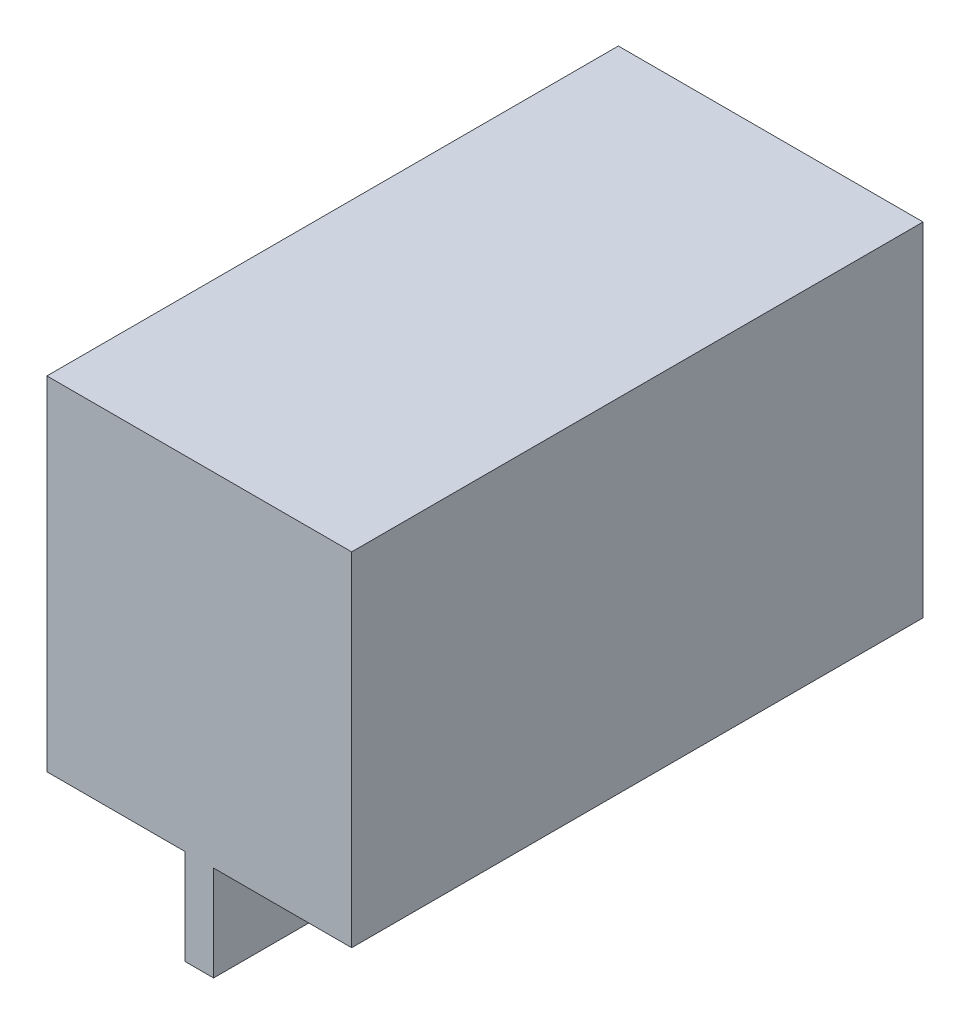
ISO-10303-21;
HEADER;
FILE_DESCRIPTION(('STEP AP214'),'2;1');
FILE_NAME('part.step','',(''),(''),'','','');
FILE_SCHEMA(('AUTOMOTIVE_DESIGN { 1 0 10303 214 1 1 1 1 }'));
ENDSEC;
DATA;
#1=APPLICATION_CONTEXT('core data for automotive mechanical design processes');
#2=APPLICATION_PROTOCOL_DEFINITION('international standard','automotive_design',2000,#1);
#3=PRODUCT_CONTEXT('',#1,'mechanical');
#4=PRODUCT('Part','Part','',(#3));
#5=PRODUCT_RELATED_PRODUCT_CATEGORY('part','',(#4));
#6=PRODUCT_DEFINITION_FORMATION('','',#4);
#7=PRODUCT_DEFINITION_CONTEXT('part definition',#1,'design');
#8=PRODUCT_DEFINITION('design','',#6,#7);
#9=PRODUCT_DEFINITION_SHAPE('','',#8);
#10=(LENGTH_UNIT() NAMED_UNIT(*) SI_UNIT(.MILLI.,.METRE.));
#11=(NAMED_UNIT(*) PLANE_ANGLE_UNIT() SI_UNIT($,.RADIAN.));
#12=(NAMED_UNIT(*) SI_UNIT($,.STERADIAN.) SOLID_ANGLE_UNIT());
#13=UNCERTAINTY_MEASURE_WITH_UNIT(LENGTH_MEASURE(1.E-05),#10,'distance_accuracy_value','');
#14=(GEOMETRIC_REPRESENTATION_CONTEXT(3) GLOBAL_UNCERTAINTY_ASSIGNED_CONTEXT((#13)) GLOBAL_UNIT_ASSIGNED_CONTEXT((#10,
#11,#12)) REPRESENTATION_CONTEXT('',''));
#15=CARTESIAN_POINT('',(0.,0.,0.));
#16=DIRECTION('',(0.,0.,1.));
#17=DIRECTION('',(1.,0.,0.));
#18=AXIS2_PLACEMENT_3D('',#15,#16,#17);
#19=CARTESIAN_POINT('',(0.,0.,0.));
#20=DIRECTION('',(0.,-1.,0.));
#21=DIRECTION('',(0.,0.,-1.));
#22=AXIS2_PLACEMENT_3D('',#19,#20,#21);
#23=PLANE('',#22);
#24=DIRECTION('',(0.,0.,-1.));
#25=VECTOR('',#24,1.);
#26=CARTESIAN_POINT('',(7.25,0.,-15.));
#27=LINE('',#26,#25);
#28=CARTESIAN_POINT('',(7.25,0.,0.));
#29=VERTEX_POINT('',#28);
#30=CARTESIAN_POINT('',(7.25,0.,-30.));
#31=VERTEX_POINT('',#30);
#32=EDGE_CURVE('E48',#29,#31,#27,.T.);
#33=ORIENTED_EDGE('',*,*,#32,.F.);
#34=DIRECTION('',(1.,0.,0.));
#35=VECTOR('',#34,1.);
#36=CARTESIAN_POINT('',(0.,0.,0.));
#37=LINE('',#36,#35);
#38=CARTESIAN_POINT('',(0.,0.,0.));
#39=VERTEX_POINT('',#38);
#40=EDGE_CURVE('E138',#39,#29,#37,.T.);
#41=ORIENTED_EDGE('',*,*,#40,.F.);
#42=DIRECTION('',(0.,0.,1.));
#43=VECTOR('',#42,1.);
#44=CARTESIAN_POINT('',(0.,0.,0.));
#45=LINE('',#44,#43);
#46=CARTESIAN_POINT('',(0.,0.,-30.));
#47=VERTEX_POINT('',#46);
#48=EDGE_CURVE('E118',#47,#39,#45,.T.);
#49=ORIENTED_EDGE('',*,*,#48,.F.);
#50=DIRECTION('',(-1.,0.,0.));
#51=VECTOR('',#50,1.);
#52=CARTESIAN_POINT('',(0.,0.,-30.));
#53=LINE('',#52,#51);
#54=EDGE_CURVE('E53',#31,#47,#53,.T.);
#55=ORIENTED_EDGE('',*,*,#54,.F.);
#56=EDGE_LOOP('',(#33,#41,#49,#55));
#57=FACE_BOUND('',#56,.T.);
#58=ADVANCED_FACE('F33',(#57),#23,.T.);
#59=CARTESIAN_POINT('',(0.,18.,0.));
#60=DIRECTION('',(1.,0.,0.));
#61=DIRECTION('',(0.,0.,-1.));
#62=AXIS2_PLACEMENT_3D('',#59,#60,#61);
#63=PLANE('',#62);
#64=ORIENTED_EDGE('',*,*,#48,.T.);
#65=DIRECTION('',(0.,-1.,0.));
#66=VECTOR('',#65,1.);
#67=CARTESIAN_POINT('',(0.,18.,0.));
#68=LINE('',#67,#66);
#69=CARTESIAN_POINT('',(0.,18.,0.));
#70=VERTEX_POINT('',#69);
#71=EDGE_CURVE('E11',#70,#39,#68,.T.);
#72=ORIENTED_EDGE('',*,*,#71,.F.);
#73=DIRECTION('',(0.,0.,1.));
#74=VECTOR('',#73,1.);
#75=CARTESIAN_POINT('',(0.,18.,0.));
#76=LINE('',#75,#74);
#77=CARTESIAN_POINT('',(0.,18.,-30.));
#78=VERTEX_POINT('',#77);
#79=EDGE_CURVE('E127',#78,#70,#76,.T.);
#80=ORIENTED_EDGE('',*,*,#79,.F.);
#81=DIRECTION('',(0.,-1.,0.));
#82=VECTOR('',#81,1.);
#83=CARTESIAN_POINT('',(0.,18.,-30.));
#84=LINE('',#83,#82);
#85=EDGE_CURVE('E136',#78,#47,#84,.T.);
#86=ORIENTED_EDGE('',*,*,#85,.T.);
#87=EDGE_LOOP('',(#64,#72,#80,#86));
#88=FACE_BOUND('',#87,.T.);
#89=ADVANCED_FACE('F35',(#88),#63,.F.);
#90=CARTESIAN_POINT('',(0.,18.,0.));
#91=DIRECTION('',(0.,0.,-1.));
#92=DIRECTION('',(-1.,0.,0.));
#93=AXIS2_PLACEMENT_3D('',#90,#91,#92);
#94=PLANE('',#93);
#95=ORIENTED_EDGE('',*,*,#40,.T.);
#96=DIRECTION('',(0.,1.,0.));
#97=VECTOR('',#96,1.);
#98=CARTESIAN_POINT('',(7.25,-5.,0.));
#99=LINE('',#98,#97);
#100=CARTESIAN_POINT('',(7.25,-5.,0.));
#101=VERTEX_POINT('',#100);
#102=EDGE_CURVE('E166',#101,#29,#99,.T.);
#103=ORIENTED_EDGE('',*,*,#102,.F.);
#104=DIRECTION('',(-1.,0.,0.));
#105=VECTOR('',#104,1.);
#106=CARTESIAN_POINT('',(7.25,-5.,0.));
#107=LINE('',#106,#105);
#108=CARTESIAN_POINT('',(8.75,-5.,0.));
#109=VERTEX_POINT('',#108);
#110=EDGE_CURVE('E112',#109,#101,#107,.T.);
#111=ORIENTED_EDGE('',*,*,#110,.F.);
#112=DIRECTION('',(0.,1.,0.));
#113=VECTOR('',#112,1.);
#114=CARTESIAN_POINT('',(8.75,-5.,0.));
#115=LINE('',#114,#113);
#116=CARTESIAN_POINT('',(8.75,0.,0.));
#117=VERTEX_POINT('',#116);
#118=EDGE_CURVE('E123',#109,#117,#115,.T.);
#119=ORIENTED_EDGE('',*,*,#118,.T.);
#120=CARTESIAN_POINT('',(16.,0.,0.));
#121=VERTEX_POINT('',#120);
#122=EDGE_CURVE('E121',#117,#121,#37,.T.);
#123=ORIENTED_EDGE('',*,*,#122,.T.);
#124=DIRECTION('',(0.,-1.,0.));
#125=VECTOR('',#124,1.);
#126=CARTESIAN_POINT('',(16.,18.,0.));
#127=LINE('',#126,#125);
#128=CARTESIAN_POINT('',(16.,18.,0.));
#129=VERTEX_POINT('',#128);
#130=EDGE_CURVE('E41',#129,#121,#127,.T.);
#131=ORIENTED_EDGE('',*,*,#130,.F.);
#132=DIRECTION('',(1.,0.,0.));
#133=VECTOR('',#132,1.);
#134=CARTESIAN_POINT('',(0.,18.,0.));
#135=LINE('',#134,#133);
#136=EDGE_CURVE('E130',#70,#129,#135,.T.);
#137=ORIENTED_EDGE('',*,*,#136,.F.);
#138=ORIENTED_EDGE('',*,*,#71,.T.);
#139=EDGE_LOOP('',(#95,#103,#111,#119,#123,#131,#137,#138));
#140=FACE_BOUND('',#139,.T.);
#141=ADVANCED_FACE('F171',(#140),#94,.F.);
#142=CARTESIAN_POINT('',(16.,18.,0.));
#143=DIRECTION('',(-1.,0.,0.));
#144=DIRECTION('',(0.,0.,1.));
#145=AXIS2_PLACEMENT_3D('',#142,#143,#144);
#146=PLANE('',#145);
#147=DIRECTION('',(0.,0.,-1.));
#148=VECTOR('',#147,1.);
#149=CARTESIAN_POINT('',(16.,0.,0.));
#150=LINE('',#149,#148);
#151=CARTESIAN_POINT('',(16.,0.,-30.));
#152=VERTEX_POINT('',#151);
#153=EDGE_CURVE('E140',#121,#152,#150,.T.);
#154=ORIENTED_EDGE('',*,*,#153,.T.);
#155=DIRECTION('',(0.,-1.,0.));
#156=VECTOR('',#155,1.);
#157=CARTESIAN_POINT('',(16.,18.,-30.));
#158=LINE('',#157,#156);
#159=CARTESIAN_POINT('',(16.,18.,-30.));
#160=VERTEX_POINT('',#159);
#161=EDGE_CURVE('E145',#160,#152,#158,.T.);
#162=ORIENTED_EDGE('',*,*,#161,.F.);
#163=DIRECTION('',(0.,0.,-1.));
#164=VECTOR('',#163,1.);
#165=CARTESIAN_POINT('',(16.,18.,0.));
#166=LINE('',#165,#164);
#167=EDGE_CURVE('E133',#129,#160,#166,.T.);
#168=ORIENTED_EDGE('',*,*,#167,.F.);
#169=ORIENTED_EDGE('',*,*,#130,.T.);
#170=EDGE_LOOP('',(#154,#162,#168,#169));
#171=FACE_BOUND('',#170,.T.);
#172=ADVANCED_FACE('F152',(#171),#146,.F.);
#173=CARTESIAN_POINT('',(0.,18.,-30.));
#174=DIRECTION('',(0.,0.,1.));
#175=DIRECTION('',(1.,0.,0.));
#176=AXIS2_PLACEMENT_3D('',#173,#174,#175);
#177=PLANE('',#176);
#178=CARTESIAN_POINT('',(8.75,0.,-30.));
#179=VERTEX_POINT('',#178);
#180=EDGE_CURVE('E131',#152,#179,#53,.T.);
#181=ORIENTED_EDGE('',*,*,#180,.T.);
#182=DIRECTION('',(0.,1.,0.));
#183=VECTOR('',#182,1.);
#184=CARTESIAN_POINT('',(8.75,-5.,-30.));
#185=LINE('',#184,#183);
#186=CARTESIAN_POINT('',(8.75,-5.,-30.));
#187=VERTEX_POINT('',#186);
#188=EDGE_CURVE('E103',#187,#179,#185,.T.);
#189=ORIENTED_EDGE('',*,*,#188,.F.);
#190=DIRECTION('',(1.,0.,0.));
#191=VECTOR('',#190,1.);
#192=CARTESIAN_POINT('',(7.25,-5.,-30.));
#193=LINE('',#192,#191);
#194=CARTESIAN_POINT('',(7.25,-5.,-30.));
#195=VERTEX_POINT('',#194);
#196=EDGE_CURVE('E96',#195,#187,#193,.T.);
#197=ORIENTED_EDGE('',*,*,#196,.F.);
#198=DIRECTION('',(0.,1.,0.));
#199=VECTOR('',#198,1.);
#200=CARTESIAN_POINT('',(7.25,-5.,-30.));
#201=LINE('',#200,#199);
#202=EDGE_CURVE('E101',#195,#31,#201,.T.);
#203=ORIENTED_EDGE('',*,*,#202,.T.);
#204=ORIENTED_EDGE('',*,*,#54,.T.);
#205=ORIENTED_EDGE('',*,*,#85,.F.);
#206=DIRECTION('',(-1.,0.,0.));
#207=VECTOR('',#206,1.);
#208=CARTESIAN_POINT('',(0.,18.,-30.));
#209=LINE('',#208,#207);
#210=EDGE_CURVE('E135',#160,#78,#209,.T.);
#211=ORIENTED_EDGE('',*,*,#210,.F.);
#212=ORIENTED_EDGE('',*,*,#161,.T.);
#213=EDGE_LOOP('',(#181,#189,#197,#203,#204,#205,#211,#212));
#214=FACE_BOUND('',#213,.T.);
#215=ADVANCED_FACE('F99',(#214),#177,.F.);
#216=CARTESIAN_POINT('',(0.,18.,0.));
#217=DIRECTION('',(0.,-1.,0.));
#218=DIRECTION('',(0.,0.,-1.));
#219=AXIS2_PLACEMENT_3D('',#216,#217,#218);
#220=PLANE('',#219);
#221=ORIENTED_EDGE('',*,*,#79,.T.);
#222=ORIENTED_EDGE('',*,*,#136,.T.);
#223=ORIENTED_EDGE('',*,*,#167,.T.);
#224=ORIENTED_EDGE('',*,*,#210,.T.);
#225=EDGE_LOOP('',(#221,#222,#223,#224));
#226=FACE_BOUND('',#225,.T.);
#227=ADVANCED_FACE('F177',(#226),#220,.F.);
#228=DIRECTION('',(0.,0.,1.));
#229=VECTOR('',#228,1.);
#230=CARTESIAN_POINT('',(8.75,0.,-15.));
#231=LINE('',#230,#229);
#232=EDGE_CURVE('E159',#179,#117,#231,.T.);
#233=ORIENTED_EDGE('',*,*,#232,.F.);
#234=ORIENTED_EDGE('',*,*,#180,.F.);
#235=ORIENTED_EDGE('',*,*,#153,.F.);
#236=ORIENTED_EDGE('',*,*,#122,.F.);
#237=EDGE_LOOP('',(#233,#234,#235,#236));
#238=FACE_BOUND('',#237,.T.);
#239=ADVANCED_FACE('F157',(#238),#23,.T.);
#240=CARTESIAN_POINT('',(8.75,-5.,-15.));
#241=DIRECTION('',(-1.,0.,0.));
#242=DIRECTION('',(0.,0.,1.));
#243=AXIS2_PLACEMENT_3D('',#240,#241,#242);
#244=PLANE('',#243);
#245=ORIENTED_EDGE('',*,*,#232,.T.);
#246=ORIENTED_EDGE('',*,*,#118,.F.);
#247=DIRECTION('',(0.,0.,1.));
#248=VECTOR('',#247,1.);
#249=CARTESIAN_POINT('',(8.75,-5.,-15.));
#250=LINE('',#249,#248);
#251=EDGE_CURVE('E106',#187,#109,#250,.T.);
#252=ORIENTED_EDGE('',*,*,#251,.F.);
#253=ORIENTED_EDGE('',*,*,#188,.T.);
#254=EDGE_LOOP('',(#245,#246,#252,#253));
#255=FACE_BOUND('',#254,.T.);
#256=ADVANCED_FACE('F162',(#255),#244,.F.);
#257=CARTESIAN_POINT('',(7.25,-5.,-15.));
#258=DIRECTION('',(1.,0.,0.));
#259=DIRECTION('',(0.,0.,-1.));
#260=AXIS2_PLACEMENT_3D('',#257,#258,#259);
#261=PLANE('',#260);
#262=ORIENTED_EDGE('',*,*,#32,.T.);
#263=ORIENTED_EDGE('',*,*,#202,.F.);
#264=DIRECTION('',(0.,0.,-1.));
#265=VECTOR('',#264,1.);
#266=CARTESIAN_POINT('',(7.25,-5.,-15.));
#267=LINE('',#266,#265);
#268=EDGE_CURVE('E107',#101,#195,#267,.T.);
#269=ORIENTED_EDGE('',*,*,#268,.F.);
#270=ORIENTED_EDGE('',*,*,#102,.T.);
#271=EDGE_LOOP('',(#262,#263,#269,#270));
#272=FACE_BOUND('',#271,.T.);
#273=ADVANCED_FACE('F117',(#272),#261,.F.);
#274=CARTESIAN_POINT('',(0.,-5.,0.));
#275=DIRECTION('',(0.,-1.,0.));
#276=DIRECTION('',(0.,0.,-1.));
#277=AXIS2_PLACEMENT_3D('',#274,#275,#276);
#278=PLANE('',#277);
#279=ORIENTED_EDGE('',*,*,#268,.T.);
#280=ORIENTED_EDGE('',*,*,#196,.T.);
#281=ORIENTED_EDGE('',*,*,#251,.T.);
#282=ORIENTED_EDGE('',*,*,#110,.T.);
#283=EDGE_LOOP('',(#279,#280,#281,#282));
#284=FACE_BOUND('',#283,.T.);
#285=ADVANCED_FACE('F110',(#284),#278,.T.);
#286=CLOSED_SHELL('',(#58,#89,#141,#172,#215,#227,#239,#256,#273,#285));
#287=MANIFOLD_SOLID_BREP('B2',#286);
#288=ADVANCED_BREP_SHAPE_REPRESENTATION('',(#18,#287),#14);
#289=SHAPE_DEFINITION_REPRESENTATION(#9,#288);
ENDSEC;
END-ISO-10303-21;
